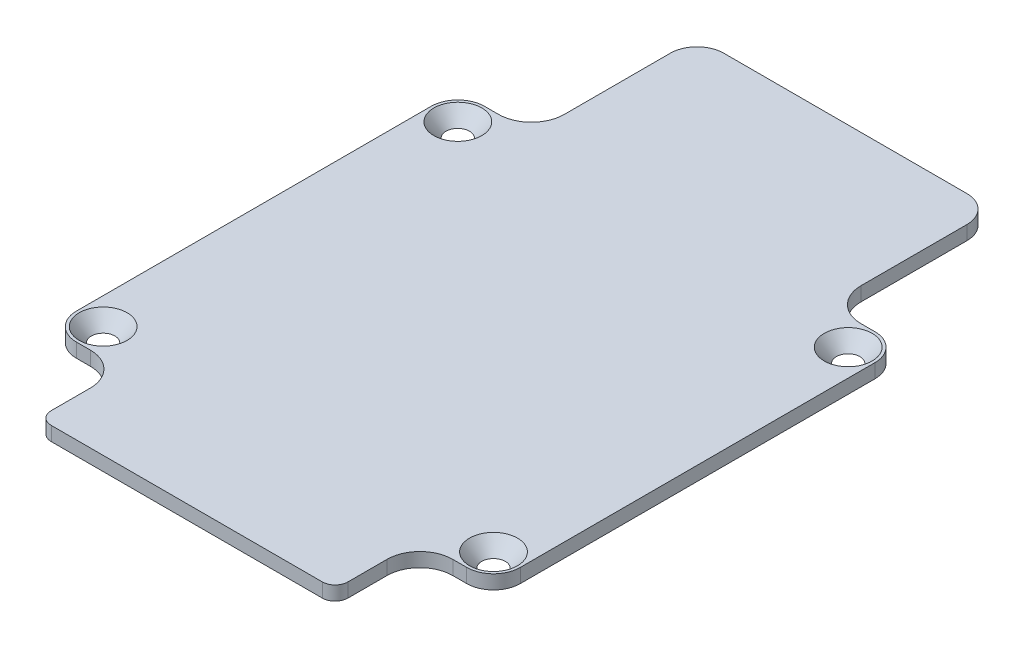
ISO-10303-21;
HEADER;
FILE_DESCRIPTION(('STEP AP214'),'2;1');
FILE_NAME('part.step','',(''),(''),'','','');
FILE_SCHEMA(('AUTOMOTIVE_DESIGN { 1 0 10303 214 1 1 1 1 }'));
ENDSEC;
DATA;
#1=APPLICATION_CONTEXT('core data for automotive mechanical design processes');
#2=APPLICATION_PROTOCOL_DEFINITION('international standard','automotive_design',2000,#1);
#3=PRODUCT_CONTEXT('',#1,'mechanical');
#4=PRODUCT('Part','Part','',(#3));
#5=PRODUCT_RELATED_PRODUCT_CATEGORY('part','',(#4));
#6=PRODUCT_DEFINITION_FORMATION('','',#4);
#7=PRODUCT_DEFINITION_CONTEXT('part definition',#1,'design');
#8=PRODUCT_DEFINITION('design','',#6,#7);
#9=PRODUCT_DEFINITION_SHAPE('','',#8);
#10=(LENGTH_UNIT() NAMED_UNIT(*) SI_UNIT(.MILLI.,.METRE.));
#11=(NAMED_UNIT(*) PLANE_ANGLE_UNIT() SI_UNIT($,.RADIAN.));
#12=(NAMED_UNIT(*) SI_UNIT($,.STERADIAN.) SOLID_ANGLE_UNIT());
#13=UNCERTAINTY_MEASURE_WITH_UNIT(LENGTH_MEASURE(1.E-05),#10,'distance_accuracy_value','');
#14=(GEOMETRIC_REPRESENTATION_CONTEXT(3) GLOBAL_UNCERTAINTY_ASSIGNED_CONTEXT((#13)) GLOBAL_UNIT_ASSIGNED_CONTEXT((#10,
#11,#12)) REPRESENTATION_CONTEXT('',''));
#15=CARTESIAN_POINT('',(0.,0.,0.));
#16=DIRECTION('',(0.,0.,1.));
#17=DIRECTION('',(1.,0.,0.));
#18=AXIS2_PLACEMENT_3D('',#15,#16,#17);
#19=CARTESIAN_POINT('',(22.225,7.925,20.193));
#20=DIRECTION('',(0.,1.,0.));
#21=DIRECTION('',(0.,0.,1.));
#22=AXIS2_PLACEMENT_3D('',#19,#20,#21);
#23=CYLINDRICAL_SURFACE('',#22,3.048);
#24=CARTESIAN_POINT('',(22.225,9.525,20.193));
#25=DIRECTION('',(0.,1.,0.));
#26=DIRECTION('',(0.,0.,1.));
#27=AXIS2_PLACEMENT_3D('',#24,#25,#26);
#28=CIRCLE('',#27,3.048);
#29=CARTESIAN_POINT('',(22.225,9.525,23.241));
#30=VERTEX_POINT('',#29);
#31=CARTESIAN_POINT('',(25.273,9.525,20.193));
#32=VERTEX_POINT('',#31);
#33=EDGE_CURVE('E228',#30,#32,#28,.T.);
#34=ORIENTED_EDGE('',*,*,#33,.F.);
#35=DIRECTION('',(0.,1.,0.));
#36=VECTOR('',#35,1.);
#37=CARTESIAN_POINT('',(22.225,7.925,23.241));
#38=LINE('',#37,#36);
#39=CARTESIAN_POINT('',(22.225,7.925,23.241));
#40=VERTEX_POINT('',#39);
#41=EDGE_CURVE('E11',#40,#30,#38,.T.);
#42=ORIENTED_EDGE('',*,*,#41,.F.);
#43=CARTESIAN_POINT('',(22.225,7.925,20.193));
#44=DIRECTION('',(0.,1.,0.));
#45=DIRECTION('',(0.,0.,1.));
#46=AXIS2_PLACEMENT_3D('',#43,#44,#45);
#47=CIRCLE('',#46,3.048);
#48=CARTESIAN_POINT('',(25.273,7.925,20.193));
#49=VERTEX_POINT('',#48);
#50=EDGE_CURVE('E297',#40,#49,#47,.T.);
#51=ORIENTED_EDGE('',*,*,#50,.T.);
#52=DIRECTION('',(0.,1.,0.));
#53=VECTOR('',#52,1.);
#54=CARTESIAN_POINT('',(25.273,7.925,20.193));
#55=LINE('',#54,#53);
#56=EDGE_CURVE('E138',#49,#32,#55,.T.);
#57=ORIENTED_EDGE('',*,*,#56,.T.);
#58=EDGE_LOOP('',(#34,#42,#51,#57));
#59=FACE_BOUND('',#58,.T.);
#60=ADVANCED_FACE('F34',(#59),#23,.T.);
#61=CARTESIAN_POINT('',(20.6375,7.925,23.241));
#62=DIRECTION('',(0.,0.,1.));
#63=DIRECTION('',(1.,0.,0.));
#64=AXIS2_PLACEMENT_3D('',#61,#62,#63);
#65=PLANE('',#64);
#66=DIRECTION('',(1.,0.,0.));
#67=VECTOR('',#66,1.);
#68=CARTESIAN_POINT('',(20.6375,9.525,23.241));
#69=LINE('',#68,#67);
#70=CARTESIAN_POINT('',(20.6375,9.525,23.241));
#71=VERTEX_POINT('',#70);
#72=EDGE_CURVE('E295',#71,#30,#69,.T.);
#73=ORIENTED_EDGE('',*,*,#72,.F.);
#74=DIRECTION('',(0.,1.,0.));
#75=VECTOR('',#74,1.);
#76=CARTESIAN_POINT('',(20.6375,7.925,23.241));
#77=LINE('',#76,#75);
#78=CARTESIAN_POINT('',(20.6375,7.925,23.241));
#79=VERTEX_POINT('',#78);
#80=EDGE_CURVE('E43',#79,#71,#77,.T.);
#81=ORIENTED_EDGE('',*,*,#80,.F.);
#82=DIRECTION('',(1.,0.,0.));
#83=VECTOR('',#82,1.);
#84=CARTESIAN_POINT('',(20.6375,7.925,23.241));
#85=LINE('',#84,#83);
#86=EDGE_CURVE('E210',#79,#40,#85,.T.);
#87=ORIENTED_EDGE('',*,*,#86,.T.);
#88=ORIENTED_EDGE('',*,*,#41,.T.);
#89=EDGE_LOOP('',(#73,#81,#87,#88));
#90=FACE_BOUND('',#89,.T.);
#91=ADVANCED_FACE('F342',(#90),#65,.T.);
#92=CARTESIAN_POINT('',(20.6375,7.925,26.9875));
#93=DIRECTION('',(0.,1.,0.));
#94=DIRECTION('',(0.,0.,1.));
#95=AXIS2_PLACEMENT_3D('',#92,#93,#94);
#96=CYLINDRICAL_SURFACE('',#95,3.74649999999999);
#97=CARTESIAN_POINT('',(20.6375,9.525,26.9875));
#98=DIRECTION('',(0.,1.,0.));
#99=DIRECTION('',(0.,0.,1.));
#100=AXIS2_PLACEMENT_3D('',#97,#98,#99);
#101=CIRCLE('',#100,3.74649999999999);
#102=CARTESIAN_POINT('',(16.891,9.525,26.9875));
#103=VERTEX_POINT('',#102);
#104=EDGE_CURVE('E214',#71,#103,#101,.T.);
#105=ORIENTED_EDGE('',*,*,#104,.T.);
#106=DIRECTION('',(0.,1.,0.));
#107=VECTOR('',#106,1.);
#108=CARTESIAN_POINT('',(16.891,7.925,26.9875));
#109=LINE('',#108,#107);
#110=CARTESIAN_POINT('',(16.891,7.925,26.9875));
#111=VERTEX_POINT('',#110);
#112=EDGE_CURVE('E212',#111,#103,#109,.T.);
#113=ORIENTED_EDGE('',*,*,#112,.F.);
#114=CARTESIAN_POINT('',(20.6375,7.925,26.9875));
#115=DIRECTION('',(0.,1.,0.));
#116=DIRECTION('',(0.,0.,1.));
#117=AXIS2_PLACEMENT_3D('',#114,#115,#116);
#118=CIRCLE('',#117,3.74649999999999);
#119=EDGE_CURVE('E203',#79,#111,#118,.T.);
#120=ORIENTED_EDGE('',*,*,#119,.F.);
#121=ORIENTED_EDGE('',*,*,#80,.T.);
#122=EDGE_LOOP('',(#105,#113,#120,#121));
#123=FACE_BOUND('',#122,.T.);
#124=ADVANCED_FACE('F213',(#123),#96,.F.);
#125=CARTESIAN_POINT('',(16.891,7.925,31.4325));
#126=DIRECTION('',(1.,0.,0.));
#127=DIRECTION('',(0.,0.,-1.));
#128=AXIS2_PLACEMENT_3D('',#125,#126,#127);
#129=PLANE('',#128);
#130=DIRECTION('',(0.,0.,-1.));
#131=VECTOR('',#130,1.);
#132=CARTESIAN_POINT('',(16.891,9.525,31.4325));
#133=LINE('',#132,#131);
#134=CARTESIAN_POINT('',(16.891,9.525,31.4325));
#135=VERTEX_POINT('',#134);
#136=EDGE_CURVE('E292',#135,#103,#133,.T.);
#137=ORIENTED_EDGE('',*,*,#136,.F.);
#138=DIRECTION('',(0.,1.,0.));
#139=VECTOR('',#138,1.);
#140=CARTESIAN_POINT('',(16.891,7.925,31.4325));
#141=LINE('',#140,#139);
#142=CARTESIAN_POINT('',(16.891,7.925,31.4325));
#143=VERTEX_POINT('',#142);
#144=EDGE_CURVE('E218',#143,#135,#141,.T.);
#145=ORIENTED_EDGE('',*,*,#144,.F.);
#146=DIRECTION('',(0.,0.,-1.));
#147=VECTOR('',#146,1.);
#148=CARTESIAN_POINT('',(16.891,7.925,31.4325));
#149=LINE('',#148,#147);
#150=EDGE_CURVE('E208',#143,#111,#149,.T.);
#151=ORIENTED_EDGE('',*,*,#150,.T.);
#152=ORIENTED_EDGE('',*,*,#112,.T.);
#153=EDGE_LOOP('',(#137,#145,#151,#152));
#154=FACE_BOUND('',#153,.T.);
#155=ADVANCED_FACE('F220',(#154),#129,.T.);
#156=CARTESIAN_POINT('',(15.4305,7.925,31.4325));
#157=DIRECTION('',(0.,1.,0.));
#158=DIRECTION('',(0.,0.,1.));
#159=AXIS2_PLACEMENT_3D('',#156,#157,#158);
#160=CYLINDRICAL_SURFACE('',#159,1.4605);
#161=CARTESIAN_POINT('',(15.4305,9.525,31.4325));
#162=DIRECTION('',(0.,1.,0.));
#163=DIRECTION('',(0.,0.,1.));
#164=AXIS2_PLACEMENT_3D('',#161,#162,#163);
#165=CIRCLE('',#164,1.4605);
#166=CARTESIAN_POINT('',(15.4305,9.525,32.893));
#167=VERTEX_POINT('',#166);
#168=EDGE_CURVE('E289',#167,#135,#165,.T.);
#169=ORIENTED_EDGE('',*,*,#168,.F.);
#170=DIRECTION('',(0.,1.,0.));
#171=VECTOR('',#170,1.);
#172=CARTESIAN_POINT('',(15.4305,7.925,32.893));
#173=LINE('',#172,#171);
#174=CARTESIAN_POINT('',(15.4305,7.925,32.893));
#175=VERTEX_POINT('',#174);
#176=EDGE_CURVE('E301',#175,#167,#173,.T.);
#177=ORIENTED_EDGE('',*,*,#176,.F.);
#178=CARTESIAN_POINT('',(15.4305,7.925,31.4325));
#179=DIRECTION('',(0.,1.,0.));
#180=DIRECTION('',(0.,0.,1.));
#181=AXIS2_PLACEMENT_3D('',#178,#179,#180);
#182=CIRCLE('',#181,1.4605);
#183=EDGE_CURVE('E221',#175,#143,#182,.T.);
#184=ORIENTED_EDGE('',*,*,#183,.T.);
#185=ORIENTED_EDGE('',*,*,#144,.T.);
#186=EDGE_LOOP('',(#169,#177,#184,#185));
#187=FACE_BOUND('',#186,.T.);
#188=ADVANCED_FACE('F355',(#187),#160,.T.);
#189=CARTESIAN_POINT('',(-15.4305,7.925,32.893));
#190=DIRECTION('',(0.,0.,1.));
#191=DIRECTION('',(1.,0.,0.));
#192=AXIS2_PLACEMENT_3D('',#189,#190,#191);
#193=PLANE('',#192);
#194=DIRECTION('',(1.,0.,0.));
#195=VECTOR('',#194,1.);
#196=CARTESIAN_POINT('',(-15.4305,9.525,32.893));
#197=LINE('',#196,#195);
#198=CARTESIAN_POINT('',(-15.4305,9.525,32.893));
#199=VERTEX_POINT('',#198);
#200=EDGE_CURVE('E286',#199,#167,#197,.T.);
#201=ORIENTED_EDGE('',*,*,#200,.F.);
#202=DIRECTION('',(0.,1.,0.));
#203=VECTOR('',#202,1.);
#204=CARTESIAN_POINT('',(-15.4305,7.925,32.893));
#205=LINE('',#204,#203);
#206=CARTESIAN_POINT('',(-15.4305,7.925,32.893));
#207=VERTEX_POINT('',#206);
#208=EDGE_CURVE('E303',#207,#199,#205,.T.);
#209=ORIENTED_EDGE('',*,*,#208,.F.);
#210=DIRECTION('',(1.,0.,0.));
#211=VECTOR('',#210,1.);
#212=CARTESIAN_POINT('',(-15.4305,7.925,32.893));
#213=LINE('',#212,#211);
#214=EDGE_CURVE('E223',#207,#175,#213,.T.);
#215=ORIENTED_EDGE('',*,*,#214,.T.);
#216=ORIENTED_EDGE('',*,*,#176,.T.);
#217=EDGE_LOOP('',(#201,#209,#215,#216));
#218=FACE_BOUND('',#217,.T.);
#219=ADVANCED_FACE('F358',(#218),#193,.T.);
#220=CARTESIAN_POINT('',(-15.4305,7.925,31.4325));
#221=DIRECTION('',(0.,1.,0.));
#222=DIRECTION('',(0.,0.,1.));
#223=AXIS2_PLACEMENT_3D('',#220,#221,#222);
#224=CYLINDRICAL_SURFACE('',#223,1.4605);
#225=CARTESIAN_POINT('',(-15.4305,9.525,31.4325));
#226=DIRECTION('',(0.,1.,0.));
#227=DIRECTION('',(0.,0.,1.));
#228=AXIS2_PLACEMENT_3D('',#225,#226,#227);
#229=CIRCLE('',#228,1.4605);
#230=CARTESIAN_POINT('',(-16.891,9.525,31.4325));
#231=VERTEX_POINT('',#230);
#232=EDGE_CURVE('E283',#231,#199,#229,.T.);
#233=ORIENTED_EDGE('',*,*,#232,.F.);
#234=DIRECTION('',(0.,1.,0.));
#235=VECTOR('',#234,1.);
#236=CARTESIAN_POINT('',(-16.891,7.925,31.4325));
#237=LINE('',#236,#235);
#238=CARTESIAN_POINT('',(-16.891,7.925,31.4325));
#239=VERTEX_POINT('',#238);
#240=EDGE_CURVE('E305',#239,#231,#237,.T.);
#241=ORIENTED_EDGE('',*,*,#240,.F.);
#242=CARTESIAN_POINT('',(-15.4305,7.925,31.4325));
#243=DIRECTION('',(0.,1.,0.));
#244=DIRECTION('',(0.,0.,1.));
#245=AXIS2_PLACEMENT_3D('',#242,#243,#244);
#246=CIRCLE('',#245,1.4605);
#247=EDGE_CURVE('E531',#239,#207,#246,.T.);
#248=ORIENTED_EDGE('',*,*,#247,.T.);
#249=ORIENTED_EDGE('',*,*,#208,.T.);
#250=EDGE_LOOP('',(#233,#241,#248,#249));
#251=FACE_BOUND('',#250,.T.);
#252=ADVANCED_FACE('F362',(#251),#224,.T.);
#253=CARTESIAN_POINT('',(-16.891,7.925,26.9875));
#254=DIRECTION('',(-1.,0.,0.));
#255=DIRECTION('',(0.,0.,1.));
#256=AXIS2_PLACEMENT_3D('',#253,#254,#255);
#257=PLANE('',#256);
#258=DIRECTION('',(0.,0.,1.));
#259=VECTOR('',#258,1.);
#260=CARTESIAN_POINT('',(-16.891,9.525,26.9875));
#261=LINE('',#260,#259);
#262=CARTESIAN_POINT('',(-16.891,9.525,26.9875));
#263=VERTEX_POINT('',#262);
#264=EDGE_CURVE('E280',#263,#231,#261,.T.);
#265=ORIENTED_EDGE('',*,*,#264,.F.);
#266=DIRECTION('',(0.,1.,0.));
#267=VECTOR('',#266,1.);
#268=CARTESIAN_POINT('',(-16.891,7.925,26.9875));
#269=LINE('',#268,#267);
#270=CARTESIAN_POINT('',(-16.891,7.925,26.9875));
#271=VERTEX_POINT('',#270);
#272=EDGE_CURVE('E307',#271,#263,#269,.T.);
#273=ORIENTED_EDGE('',*,*,#272,.F.);
#274=DIRECTION('',(0.,0.,1.));
#275=VECTOR('',#274,1.);
#276=CARTESIAN_POINT('',(-16.891,7.925,26.9875));
#277=LINE('',#276,#275);
#278=EDGE_CURVE('E528',#271,#239,#277,.T.);
#279=ORIENTED_EDGE('',*,*,#278,.T.);
#280=ORIENTED_EDGE('',*,*,#240,.T.);
#281=EDGE_LOOP('',(#265,#273,#279,#280));
#282=FACE_BOUND('',#281,.T.);
#283=ADVANCED_FACE('F366',(#282),#257,.T.);
#284=CARTESIAN_POINT('',(-20.6375,7.925,26.9875));
#285=DIRECTION('',(0.,1.,0.));
#286=DIRECTION('',(0.,0.,1.));
#287=AXIS2_PLACEMENT_3D('',#284,#285,#286);
#288=CYLINDRICAL_SURFACE('',#287,3.7465);
#289=CARTESIAN_POINT('',(-20.6375,9.525,26.9875));
#290=DIRECTION('',(0.,1.,0.));
#291=DIRECTION('',(0.,0.,1.));
#292=AXIS2_PLACEMENT_3D('',#289,#290,#291);
#293=CIRCLE('',#292,3.7465);
#294=CARTESIAN_POINT('',(-20.6375,9.525,23.241));
#295=VERTEX_POINT('',#294);
#296=EDGE_CURVE('E277',#263,#295,#293,.T.);
#297=ORIENTED_EDGE('',*,*,#296,.T.);
#298=DIRECTION('',(0.,1.,0.));
#299=VECTOR('',#298,1.);
#300=CARTESIAN_POINT('',(-20.6375,7.925,23.241));
#301=LINE('',#300,#299);
#302=CARTESIAN_POINT('',(-20.6375,7.925,23.241));
#303=VERTEX_POINT('',#302);
#304=EDGE_CURVE('E309',#303,#295,#301,.T.);
#305=ORIENTED_EDGE('',*,*,#304,.F.);
#306=CARTESIAN_POINT('',(-20.6375,7.925,26.9875));
#307=DIRECTION('',(0.,1.,0.));
#308=DIRECTION('',(0.,0.,1.));
#309=AXIS2_PLACEMENT_3D('',#306,#307,#308);
#310=CIRCLE('',#309,3.7465);
#311=EDGE_CURVE('E526',#271,#303,#310,.T.);
#312=ORIENTED_EDGE('',*,*,#311,.F.);
#313=ORIENTED_EDGE('',*,*,#272,.T.);
#314=EDGE_LOOP('',(#297,#305,#312,#313));
#315=FACE_BOUND('',#314,.T.);
#316=ADVANCED_FACE('F370',(#315),#288,.F.);
#317=CARTESIAN_POINT('',(-22.225,7.925,23.241));
#318=DIRECTION('',(0.,0.,1.));
#319=DIRECTION('',(1.,0.,0.));
#320=AXIS2_PLACEMENT_3D('',#317,#318,#319);
#321=PLANE('',#320);
#322=DIRECTION('',(1.,0.,0.));
#323=VECTOR('',#322,1.);
#324=CARTESIAN_POINT('',(-22.225,9.525,23.241));
#325=LINE('',#324,#323);
#326=CARTESIAN_POINT('',(-22.225,9.525,23.241));
#327=VERTEX_POINT('',#326);
#328=EDGE_CURVE('E274',#327,#295,#325,.T.);
#329=ORIENTED_EDGE('',*,*,#328,.F.);
#330=DIRECTION('',(0.,1.,0.));
#331=VECTOR('',#330,1.);
#332=CARTESIAN_POINT('',(-22.225,7.925,23.241));
#333=LINE('',#332,#331);
#334=CARTESIAN_POINT('',(-22.225,7.925,23.241));
#335=VERTEX_POINT('',#334);
#336=EDGE_CURVE('E311',#335,#327,#333,.T.);
#337=ORIENTED_EDGE('',*,*,#336,.F.);
#338=DIRECTION('',(1.,0.,0.));
#339=VECTOR('',#338,1.);
#340=CARTESIAN_POINT('',(-22.225,7.925,23.241));
#341=LINE('',#340,#339);
#342=EDGE_CURVE('E523',#335,#303,#341,.T.);
#343=ORIENTED_EDGE('',*,*,#342,.T.);
#344=ORIENTED_EDGE('',*,*,#304,.T.);
#345=EDGE_LOOP('',(#329,#337,#343,#344));
#346=FACE_BOUND('',#345,.T.);
#347=ADVANCED_FACE('F374',(#346),#321,.T.);
#348=CARTESIAN_POINT('',(-22.225,7.925,20.193));
#349=DIRECTION('',(0.,1.,0.));
#350=DIRECTION('',(0.,0.,1.));
#351=AXIS2_PLACEMENT_3D('',#348,#349,#350);
#352=CYLINDRICAL_SURFACE('',#351,3.048);
#353=CARTESIAN_POINT('',(-22.225,9.525,20.193));
#354=DIRECTION('',(0.,1.,0.));
#355=DIRECTION('',(0.,0.,1.));
#356=AXIS2_PLACEMENT_3D('',#353,#354,#355);
#357=CIRCLE('',#356,3.048);
#358=CARTESIAN_POINT('',(-25.273,9.525,20.193));
#359=VERTEX_POINT('',#358);
#360=EDGE_CURVE('E271',#359,#327,#357,.T.);
#361=ORIENTED_EDGE('',*,*,#360,.F.);
#362=DIRECTION('',(0.,1.,0.));
#363=VECTOR('',#362,1.);
#364=CARTESIAN_POINT('',(-25.273,7.925,20.193));
#365=LINE('',#364,#363);
#366=CARTESIAN_POINT('',(-25.273,7.925,20.193));
#367=VERTEX_POINT('',#366);
#368=EDGE_CURVE('E313',#367,#359,#365,.T.);
#369=ORIENTED_EDGE('',*,*,#368,.F.);
#370=CARTESIAN_POINT('',(-22.225,7.925,20.193));
#371=DIRECTION('',(0.,1.,0.));
#372=DIRECTION('',(0.,0.,1.));
#373=AXIS2_PLACEMENT_3D('',#370,#371,#372);
#374=CIRCLE('',#373,3.048);
#375=EDGE_CURVE('E520',#367,#335,#374,.T.);
#376=ORIENTED_EDGE('',*,*,#375,.T.);
#377=ORIENTED_EDGE('',*,*,#336,.T.);
#378=EDGE_LOOP('',(#361,#369,#376,#377));
#379=FACE_BOUND('',#378,.T.);
#380=ADVANCED_FACE('F378',(#379),#352,.T.);
#381=CARTESIAN_POINT('',(-25.273,7.925,-20.193));
#382=DIRECTION('',(-1.,0.,0.));
#383=DIRECTION('',(0.,0.,1.));
#384=AXIS2_PLACEMENT_3D('',#381,#382,#383);
#385=PLANE('',#384);
#386=DIRECTION('',(0.,0.,1.));
#387=VECTOR('',#386,1.);
#388=CARTESIAN_POINT('',(-25.273,9.525,-20.193));
#389=LINE('',#388,#387);
#390=CARTESIAN_POINT('',(-25.273,9.525,-20.193));
#391=VERTEX_POINT('',#390);
#392=EDGE_CURVE('E268',#391,#359,#389,.T.);
#393=ORIENTED_EDGE('',*,*,#392,.F.);
#394=DIRECTION('',(0.,1.,0.));
#395=VECTOR('',#394,1.);
#396=CARTESIAN_POINT('',(-25.273,7.925,-20.193));
#397=LINE('',#396,#395);
#398=CARTESIAN_POINT('',(-25.273,7.925,-20.193));
#399=VERTEX_POINT('',#398);
#400=EDGE_CURVE('E315',#399,#391,#397,.T.);
#401=ORIENTED_EDGE('',*,*,#400,.F.);
#402=DIRECTION('',(0.,0.,1.));
#403=VECTOR('',#402,1.);
#404=CARTESIAN_POINT('',(-25.273,7.925,-20.193));
#405=LINE('',#404,#403);
#406=EDGE_CURVE('E517',#399,#367,#405,.T.);
#407=ORIENTED_EDGE('',*,*,#406,.T.);
#408=ORIENTED_EDGE('',*,*,#368,.T.);
#409=EDGE_LOOP('',(#393,#401,#407,#408));
#410=FACE_BOUND('',#409,.T.);
#411=ADVANCED_FACE('F382',(#410),#385,.T.);
#412=CARTESIAN_POINT('',(-22.225,7.925,-20.193));
#413=DIRECTION('',(0.,1.,0.));
#414=DIRECTION('',(0.,0.,1.));
#415=AXIS2_PLACEMENT_3D('',#412,#413,#414);
#416=CYLINDRICAL_SURFACE('',#415,3.04800000000001);
#417=CARTESIAN_POINT('',(-22.225,9.525,-20.193));
#418=DIRECTION('',(0.,1.,0.));
#419=DIRECTION('',(0.,0.,1.));
#420=AXIS2_PLACEMENT_3D('',#417,#418,#419);
#421=CIRCLE('',#420,3.04800000000001);
#422=CARTESIAN_POINT('',(-22.225,9.525,-23.241));
#423=VERTEX_POINT('',#422);
#424=EDGE_CURVE('E265',#423,#391,#421,.T.);
#425=ORIENTED_EDGE('',*,*,#424,.F.);
#426=DIRECTION('',(0.,1.,0.));
#427=VECTOR('',#426,1.);
#428=CARTESIAN_POINT('',(-22.225,7.925,-23.241));
#429=LINE('',#428,#427);
#430=CARTESIAN_POINT('',(-22.225,7.925,-23.241));
#431=VERTEX_POINT('',#430);
#432=EDGE_CURVE('E317',#431,#423,#429,.T.);
#433=ORIENTED_EDGE('',*,*,#432,.F.);
#434=CARTESIAN_POINT('',(-22.225,7.925,-20.193));
#435=DIRECTION('',(0.,1.,0.));
#436=DIRECTION('',(0.,0.,1.));
#437=AXIS2_PLACEMENT_3D('',#434,#435,#436);
#438=CIRCLE('',#437,3.04800000000001);
#439=EDGE_CURVE('E514',#431,#399,#438,.T.);
#440=ORIENTED_EDGE('',*,*,#439,.T.);
#441=ORIENTED_EDGE('',*,*,#400,.T.);
#442=EDGE_LOOP('',(#425,#433,#440,#441));
#443=FACE_BOUND('',#442,.T.);
#444=ADVANCED_FACE('F386',(#443),#416,.T.);
#445=CARTESIAN_POINT('',(-20.6375,7.925,-23.241));
#446=DIRECTION('',(0.,0.,-1.));
#447=DIRECTION('',(-1.,0.,0.));
#448=AXIS2_PLACEMENT_3D('',#445,#446,#447);
#449=PLANE('',#448);
#450=DIRECTION('',(-1.,0.,0.));
#451=VECTOR('',#450,1.);
#452=CARTESIAN_POINT('',(-20.6375,9.525,-23.241));
#453=LINE('',#452,#451);
#454=CARTESIAN_POINT('',(-20.6375,9.525,-23.241));
#455=VERTEX_POINT('',#454);
#456=EDGE_CURVE('E262',#455,#423,#453,.T.);
#457=ORIENTED_EDGE('',*,*,#456,.F.);
#458=DIRECTION('',(0.,1.,0.));
#459=VECTOR('',#458,1.);
#460=CARTESIAN_POINT('',(-20.6375,7.925,-23.241));
#461=LINE('',#460,#459);
#462=CARTESIAN_POINT('',(-20.6375,7.925,-23.241));
#463=VERTEX_POINT('',#462);
#464=EDGE_CURVE('E319',#463,#455,#461,.T.);
#465=ORIENTED_EDGE('',*,*,#464,.F.);
#466=DIRECTION('',(-1.,0.,0.));
#467=VECTOR('',#466,1.);
#468=CARTESIAN_POINT('',(-20.6375,7.925,-23.241));
#469=LINE('',#468,#467);
#470=EDGE_CURVE('E511',#463,#431,#469,.T.);
#471=ORIENTED_EDGE('',*,*,#470,.T.);
#472=ORIENTED_EDGE('',*,*,#432,.T.);
#473=EDGE_LOOP('',(#457,#465,#471,#472));
#474=FACE_BOUND('',#473,.T.);
#475=ADVANCED_FACE('F390',(#474),#449,.T.);
#476=CARTESIAN_POINT('',(-20.6375,7.925,-26.9875));
#477=DIRECTION('',(0.,1.,0.));
#478=DIRECTION('',(0.,0.,1.));
#479=AXIS2_PLACEMENT_3D('',#476,#477,#478);
#480=CYLINDRICAL_SURFACE('',#479,3.74649999999998);
#481=CARTESIAN_POINT('',(-20.6375,9.525,-26.9875));
#482=DIRECTION('',(0.,1.,0.));
#483=DIRECTION('',(0.,0.,1.));
#484=AXIS2_PLACEMENT_3D('',#481,#482,#483);
#485=CIRCLE('',#484,3.74649999999998);
#486=CARTESIAN_POINT('',(-16.891,9.525,-26.9875));
#487=VERTEX_POINT('',#486);
#488=EDGE_CURVE('E259',#455,#487,#485,.T.);
#489=ORIENTED_EDGE('',*,*,#488,.T.);
#490=DIRECTION('',(0.,1.,0.));
#491=VECTOR('',#490,1.);
#492=CARTESIAN_POINT('',(-16.891,7.925,-26.9875));
#493=LINE('',#492,#491);
#494=CARTESIAN_POINT('',(-16.891,7.925,-26.9875));
#495=VERTEX_POINT('',#494);
#496=EDGE_CURVE('E321',#495,#487,#493,.T.);
#497=ORIENTED_EDGE('',*,*,#496,.F.);
#498=CARTESIAN_POINT('',(-20.6375,7.925,-26.9875));
#499=DIRECTION('',(0.,1.,0.));
#500=DIRECTION('',(0.,0.,1.));
#501=AXIS2_PLACEMENT_3D('',#498,#499,#500);
#502=CIRCLE('',#501,3.74649999999998);
#503=EDGE_CURVE('E509',#463,#495,#502,.T.);
#504=ORIENTED_EDGE('',*,*,#503,.F.);
#505=ORIENTED_EDGE('',*,*,#464,.T.);
#506=EDGE_LOOP('',(#489,#497,#504,#505));
#507=FACE_BOUND('',#506,.T.);
#508=ADVANCED_FACE('F394',(#507),#480,.F.);
#509=CARTESIAN_POINT('',(-16.891,7.925,-39.0525));
#510=DIRECTION('',(-1.,0.,0.));
#511=DIRECTION('',(0.,0.,1.));
#512=AXIS2_PLACEMENT_3D('',#509,#510,#511);
#513=PLANE('',#512);
#514=DIRECTION('',(0.,0.,1.));
#515=VECTOR('',#514,1.);
#516=CARTESIAN_POINT('',(-16.891,9.525,-39.0525));
#517=LINE('',#516,#515);
#518=CARTESIAN_POINT('',(-16.891,9.525,-39.0525));
#519=VERTEX_POINT('',#518);
#520=EDGE_CURVE('E256',#519,#487,#517,.T.);
#521=ORIENTED_EDGE('',*,*,#520,.F.);
#522=DIRECTION('',(0.,1.,0.));
#523=VECTOR('',#522,1.);
#524=CARTESIAN_POINT('',(-16.891,7.925,-39.0525));
#525=LINE('',#524,#523);
#526=CARTESIAN_POINT('',(-16.891,7.925,-39.0525));
#527=VERTEX_POINT('',#526);
#528=EDGE_CURVE('E323',#527,#519,#525,.T.);
#529=ORIENTED_EDGE('',*,*,#528,.F.);
#530=DIRECTION('',(0.,0.,1.));
#531=VECTOR('',#530,1.);
#532=CARTESIAN_POINT('',(-16.891,7.925,-39.0525));
#533=LINE('',#532,#531);
#534=EDGE_CURVE('E506',#527,#495,#533,.T.);
#535=ORIENTED_EDGE('',*,*,#534,.T.);
#536=ORIENTED_EDGE('',*,*,#496,.T.);
#537=EDGE_LOOP('',(#521,#529,#535,#536));
#538=FACE_BOUND('',#537,.T.);
#539=ADVANCED_FACE('F398',(#538),#513,.T.);
#540=CARTESIAN_POINT('',(-13.843,7.925,-39.0525));
#541=DIRECTION('',(0.,1.,0.));
#542=DIRECTION('',(0.,0.,1.));
#543=AXIS2_PLACEMENT_3D('',#540,#541,#542);
#544=CYLINDRICAL_SURFACE('',#543,3.048);
#545=CARTESIAN_POINT('',(-13.843,9.525,-39.0525));
#546=DIRECTION('',(0.,1.,0.));
#547=DIRECTION('',(0.,0.,1.));
#548=AXIS2_PLACEMENT_3D('',#545,#546,#547);
#549=CIRCLE('',#548,3.048);
#550=CARTESIAN_POINT('',(-13.843,9.525,-42.1005));
#551=VERTEX_POINT('',#550);
#552=EDGE_CURVE('E253',#551,#519,#549,.T.);
#553=ORIENTED_EDGE('',*,*,#552,.F.);
#554=DIRECTION('',(0.,1.,0.));
#555=VECTOR('',#554,1.);
#556=CARTESIAN_POINT('',(-13.843,7.925,-42.1005));
#557=LINE('',#556,#555);
#558=CARTESIAN_POINT('',(-13.843,7.925,-42.1005));
#559=VERTEX_POINT('',#558);
#560=EDGE_CURVE('E325',#559,#551,#557,.T.);
#561=ORIENTED_EDGE('',*,*,#560,.F.);
#562=CARTESIAN_POINT('',(-13.843,7.925,-39.0525));
#563=DIRECTION('',(0.,1.,0.));
#564=DIRECTION('',(0.,0.,1.));
#565=AXIS2_PLACEMENT_3D('',#562,#563,#564);
#566=CIRCLE('',#565,3.048);
#567=EDGE_CURVE('E503',#559,#527,#566,.T.);
#568=ORIENTED_EDGE('',*,*,#567,.T.);
#569=ORIENTED_EDGE('',*,*,#528,.T.);
#570=EDGE_LOOP('',(#553,#561,#568,#569));
#571=FACE_BOUND('',#570,.T.);
#572=ADVANCED_FACE('F402',(#571),#544,.T.);
#573=CARTESIAN_POINT('',(13.843,7.925,-42.1005));
#574=DIRECTION('',(0.,0.,-1.));
#575=DIRECTION('',(-1.,0.,0.));
#576=AXIS2_PLACEMENT_3D('',#573,#574,#575);
#577=PLANE('',#576);
#578=DIRECTION('',(-1.,0.,0.));
#579=VECTOR('',#578,1.);
#580=CARTESIAN_POINT('',(13.843,9.525,-42.1005));
#581=LINE('',#580,#579);
#582=CARTESIAN_POINT('',(13.843,9.525,-42.1005));
#583=VERTEX_POINT('',#582);
#584=EDGE_CURVE('E250',#583,#551,#581,.T.);
#585=ORIENTED_EDGE('',*,*,#584,.F.);
#586=DIRECTION('',(0.,1.,0.));
#587=VECTOR('',#586,1.);
#588=CARTESIAN_POINT('',(13.843,7.925,-42.1005));
#589=LINE('',#588,#587);
#590=CARTESIAN_POINT('',(13.843,7.925,-42.1005));
#591=VERTEX_POINT('',#590);
#592=EDGE_CURVE('E327',#591,#583,#589,.T.);
#593=ORIENTED_EDGE('',*,*,#592,.F.);
#594=DIRECTION('',(-1.,0.,0.));
#595=VECTOR('',#594,1.);
#596=CARTESIAN_POINT('',(13.843,7.925,-42.1005));
#597=LINE('',#596,#595);
#598=EDGE_CURVE('E500',#591,#559,#597,.T.);
#599=ORIENTED_EDGE('',*,*,#598,.T.);
#600=ORIENTED_EDGE('',*,*,#560,.T.);
#601=EDGE_LOOP('',(#585,#593,#599,#600));
#602=FACE_BOUND('',#601,.T.);
#603=ADVANCED_FACE('F406',(#602),#577,.T.);
#604=CARTESIAN_POINT('',(13.843,7.925,-39.0525));
#605=DIRECTION('',(0.,1.,0.));
#606=DIRECTION('',(0.,0.,1.));
#607=AXIS2_PLACEMENT_3D('',#604,#605,#606);
#608=CYLINDRICAL_SURFACE('',#607,3.048);
#609=CARTESIAN_POINT('',(13.843,9.525,-39.0525));
#610=DIRECTION('',(0.,1.,0.));
#611=DIRECTION('',(0.,0.,1.));
#612=AXIS2_PLACEMENT_3D('',#609,#610,#611);
#613=CIRCLE('',#612,3.048);
#614=CARTESIAN_POINT('',(16.891,9.525,-39.0525));
#615=VERTEX_POINT('',#614);
#616=EDGE_CURVE('E247',#615,#583,#613,.T.);
#617=ORIENTED_EDGE('',*,*,#616,.F.);
#618=DIRECTION('',(0.,1.,0.));
#619=VECTOR('',#618,1.);
#620=CARTESIAN_POINT('',(16.891,7.925,-39.0525));
#621=LINE('',#620,#619);
#622=CARTESIAN_POINT('',(16.891,7.925,-39.0525));
#623=VERTEX_POINT('',#622);
#624=EDGE_CURVE('E329',#623,#615,#621,.T.);
#625=ORIENTED_EDGE('',*,*,#624,.F.);
#626=CARTESIAN_POINT('',(13.843,7.925,-39.0525));
#627=DIRECTION('',(0.,1.,0.));
#628=DIRECTION('',(0.,0.,1.));
#629=AXIS2_PLACEMENT_3D('',#626,#627,#628);
#630=CIRCLE('',#629,3.048);
#631=EDGE_CURVE('E497',#623,#591,#630,.T.);
#632=ORIENTED_EDGE('',*,*,#631,.T.);
#633=ORIENTED_EDGE('',*,*,#592,.T.);
#634=EDGE_LOOP('',(#617,#625,#632,#633));
#635=FACE_BOUND('',#634,.T.);
#636=ADVANCED_FACE('F410',(#635),#608,.T.);
#637=CARTESIAN_POINT('',(16.891,7.925,-26.9875));
#638=DIRECTION('',(1.,0.,0.));
#639=DIRECTION('',(0.,0.,-1.));
#640=AXIS2_PLACEMENT_3D('',#637,#638,#639);
#641=PLANE('',#640);
#642=DIRECTION('',(0.,0.,-1.));
#643=VECTOR('',#642,1.);
#644=CARTESIAN_POINT('',(16.891,9.525,-26.9875));
#645=LINE('',#644,#643);
#646=CARTESIAN_POINT('',(16.891,9.525,-26.9875));
#647=VERTEX_POINT('',#646);
#648=EDGE_CURVE('E244',#647,#615,#645,.T.);
#649=ORIENTED_EDGE('',*,*,#648,.F.);
#650=DIRECTION('',(0.,1.,0.));
#651=VECTOR('',#650,1.);
#652=CARTESIAN_POINT('',(16.891,7.925,-26.9875));
#653=LINE('',#652,#651);
#654=CARTESIAN_POINT('',(16.891,7.925,-26.9875));
#655=VERTEX_POINT('',#654);
#656=EDGE_CURVE('E331',#655,#647,#653,.T.);
#657=ORIENTED_EDGE('',*,*,#656,.F.);
#658=DIRECTION('',(0.,0.,-1.));
#659=VECTOR('',#658,1.);
#660=CARTESIAN_POINT('',(16.891,7.925,-26.9875));
#661=LINE('',#660,#659);
#662=EDGE_CURVE('E494',#655,#623,#661,.T.);
#663=ORIENTED_EDGE('',*,*,#662,.T.);
#664=ORIENTED_EDGE('',*,*,#624,.T.);
#665=EDGE_LOOP('',(#649,#657,#663,#664));
#666=FACE_BOUND('',#665,.T.);
#667=ADVANCED_FACE('F414',(#666),#641,.T.);
#668=CARTESIAN_POINT('',(20.6375,7.925,-26.9875));
#669=DIRECTION('',(0.,1.,0.));
#670=DIRECTION('',(0.,0.,1.));
#671=AXIS2_PLACEMENT_3D('',#668,#669,#670);
#672=CYLINDRICAL_SURFACE('',#671,3.74649999999998);
#673=CARTESIAN_POINT('',(20.6375,9.525,-26.9875));
#674=DIRECTION('',(0.,1.,0.));
#675=DIRECTION('',(0.,0.,1.));
#676=AXIS2_PLACEMENT_3D('',#673,#674,#675);
#677=CIRCLE('',#676,3.74649999999998);
#678=CARTESIAN_POINT('',(20.6375,9.525,-23.241));
#679=VERTEX_POINT('',#678);
#680=EDGE_CURVE('E241',#647,#679,#677,.T.);
#681=ORIENTED_EDGE('',*,*,#680,.T.);
#682=DIRECTION('',(0.,1.,0.));
#683=VECTOR('',#682,1.);
#684=CARTESIAN_POINT('',(20.6375,7.925,-23.241));
#685=LINE('',#684,#683);
#686=CARTESIAN_POINT('',(20.6375,7.925,-23.241));
#687=VERTEX_POINT('',#686);
#688=EDGE_CURVE('E333',#687,#679,#685,.T.);
#689=ORIENTED_EDGE('',*,*,#688,.F.);
#690=CARTESIAN_POINT('',(20.6375,7.925,-26.9875));
#691=DIRECTION('',(0.,1.,0.));
#692=DIRECTION('',(0.,0.,1.));
#693=AXIS2_PLACEMENT_3D('',#690,#691,#692);
#694=CIRCLE('',#693,3.74649999999998);
#695=EDGE_CURVE('E492',#655,#687,#694,.T.);
#696=ORIENTED_EDGE('',*,*,#695,.F.);
#697=ORIENTED_EDGE('',*,*,#656,.T.);
#698=EDGE_LOOP('',(#681,#689,#696,#697));
#699=FACE_BOUND('',#698,.T.);
#700=ADVANCED_FACE('F418',(#699),#672,.F.);
#701=CARTESIAN_POINT('',(22.225,7.925,-23.241));
#702=DIRECTION('',(0.,0.,-1.));
#703=DIRECTION('',(-1.,0.,0.));
#704=AXIS2_PLACEMENT_3D('',#701,#702,#703);
#705=PLANE('',#704);
#706=DIRECTION('',(-1.,0.,0.));
#707=VECTOR('',#706,1.);
#708=CARTESIAN_POINT('',(22.225,9.525,-23.241));
#709=LINE('',#708,#707);
#710=CARTESIAN_POINT('',(22.225,9.525,-23.241));
#711=VERTEX_POINT('',#710);
#712=EDGE_CURVE('E238',#711,#679,#709,.T.);
#713=ORIENTED_EDGE('',*,*,#712,.F.);
#714=DIRECTION('',(0.,1.,0.));
#715=VECTOR('',#714,1.);
#716=CARTESIAN_POINT('',(22.225,7.925,-23.241));
#717=LINE('',#716,#715);
#718=CARTESIAN_POINT('',(22.225,7.925,-23.241));
#719=VERTEX_POINT('',#718);
#720=EDGE_CURVE('E335',#719,#711,#717,.T.);
#721=ORIENTED_EDGE('',*,*,#720,.F.);
#722=DIRECTION('',(-1.,0.,0.));
#723=VECTOR('',#722,1.);
#724=CARTESIAN_POINT('',(22.225,7.925,-23.241));
#725=LINE('',#724,#723);
#726=EDGE_CURVE('E489',#719,#687,#725,.T.);
#727=ORIENTED_EDGE('',*,*,#726,.T.);
#728=ORIENTED_EDGE('',*,*,#688,.T.);
#729=EDGE_LOOP('',(#713,#721,#727,#728));
#730=FACE_BOUND('',#729,.T.);
#731=ADVANCED_FACE('F422',(#730),#705,.T.);
#732=CARTESIAN_POINT('',(22.225,7.925,-20.193));
#733=DIRECTION('',(0.,1.,0.));
#734=DIRECTION('',(0.,0.,1.));
#735=AXIS2_PLACEMENT_3D('',#732,#733,#734);
#736=CYLINDRICAL_SURFACE('',#735,3.04800000000001);
#737=CARTESIAN_POINT('',(22.225,9.525,-20.193));
#738=DIRECTION('',(0.,1.,0.));
#739=DIRECTION('',(0.,0.,1.));
#740=AXIS2_PLACEMENT_3D('',#737,#738,#739);
#741=CIRCLE('',#740,3.04800000000001);
#742=CARTESIAN_POINT('',(25.273,9.525,-20.193));
#743=VERTEX_POINT('',#742);
#744=EDGE_CURVE('E235',#743,#711,#741,.T.);
#745=ORIENTED_EDGE('',*,*,#744,.F.);
#746=DIRECTION('',(0.,1.,0.));
#747=VECTOR('',#746,1.);
#748=CARTESIAN_POINT('',(25.273,7.925,-20.193));
#749=LINE('',#748,#747);
#750=CARTESIAN_POINT('',(25.273,7.925,-20.193));
#751=VERTEX_POINT('',#750);
#752=EDGE_CURVE('E337',#751,#743,#749,.T.);
#753=ORIENTED_EDGE('',*,*,#752,.F.);
#754=CARTESIAN_POINT('',(22.225,7.925,-20.193));
#755=DIRECTION('',(0.,1.,0.));
#756=DIRECTION('',(0.,0.,1.));
#757=AXIS2_PLACEMENT_3D('',#754,#755,#756);
#758=CIRCLE('',#757,3.04800000000001);
#759=EDGE_CURVE('E486',#751,#719,#758,.T.);
#760=ORIENTED_EDGE('',*,*,#759,.T.);
#761=ORIENTED_EDGE('',*,*,#720,.T.);
#762=EDGE_LOOP('',(#745,#753,#760,#761));
#763=FACE_BOUND('',#762,.T.);
#764=ADVANCED_FACE('F426',(#763),#736,.T.);
#765=CARTESIAN_POINT('',(25.273,7.925,20.193));
#766=DIRECTION('',(1.,0.,0.));
#767=DIRECTION('',(0.,0.,-1.));
#768=AXIS2_PLACEMENT_3D('',#765,#766,#767);
#769=PLANE('',#768);
#770=DIRECTION('',(0.,0.,-1.));
#771=VECTOR('',#770,1.);
#772=CARTESIAN_POINT('',(25.273,9.525,20.193));
#773=LINE('',#772,#771);
#774=EDGE_CURVE('E231',#32,#743,#773,.T.);
#775=ORIENTED_EDGE('',*,*,#774,.F.);
#776=ORIENTED_EDGE('',*,*,#56,.F.);
#777=DIRECTION('',(0.,0.,-1.));
#778=VECTOR('',#777,1.);
#779=CARTESIAN_POINT('',(25.273,7.925,20.193));
#780=LINE('',#779,#778);
#781=EDGE_CURVE('E484',#49,#751,#780,.T.);
#782=ORIENTED_EDGE('',*,*,#781,.T.);
#783=ORIENTED_EDGE('',*,*,#752,.T.);
#784=EDGE_LOOP('',(#775,#776,#782,#783));
#785=FACE_BOUND('',#784,.T.);
#786=ADVANCED_FACE('F338',(#785),#769,.T.);
#787=CARTESIAN_POINT('',(22.225,7.925,20.193));
#788=DIRECTION('',(0.,1.,0.));
#789=DIRECTION('',(0.,0.,1.));
#790=AXIS2_PLACEMENT_3D('',#787,#788,#789);
#791=PLANE('',#790);
#792=CARTESIAN_POINT('',(22.225,7.925,20.193));
#793=DIRECTION('',(0.,1.,0.));
#794=DIRECTION('',(0.,0.,1.));
#795=AXIS2_PLACEMENT_3D('',#792,#793,#794);
#796=CIRCLE('',#795,1.33964121949404);
#797=CARTESIAN_POINT('',(22.225,7.925,21.532641219494));
#798=VERTEX_POINT('',#797);
#799=EDGE_CURVE('E37',#798,#798,#796,.T.);
#800=ORIENTED_EDGE('',*,*,#799,.T.);
#801=EDGE_LOOP('',(#800));
#802=FACE_BOUND('',#801,.T.);
#803=CARTESIAN_POINT('',(-22.225,7.925,20.193));
#804=DIRECTION('',(0.,1.,0.));
#805=DIRECTION('',(0.,0.,1.));
#806=AXIS2_PLACEMENT_3D('',#803,#804,#805);
#807=CIRCLE('',#806,1.33964121949404);
#808=CARTESIAN_POINT('',(-22.225,7.925,21.532641219494));
#809=VERTEX_POINT('',#808);
#810=EDGE_CURVE('E466',#809,#809,#807,.T.);
#811=ORIENTED_EDGE('',*,*,#810,.T.);
#812=EDGE_LOOP('',(#811));
#813=FACE_BOUND('',#812,.T.);
#814=CARTESIAN_POINT('',(-22.225,7.925,-20.193));
#815=DIRECTION('',(0.,1.,0.));
#816=DIRECTION('',(0.,0.,1.));
#817=AXIS2_PLACEMENT_3D('',#814,#815,#816);
#818=CIRCLE('',#817,1.33964121949404);
#819=CARTESIAN_POINT('',(-22.225,7.925,-18.853358780506));
#820=VERTEX_POINT('',#819);
#821=EDGE_CURVE('E475',#820,#820,#818,.T.);
#822=ORIENTED_EDGE('',*,*,#821,.T.);
#823=EDGE_LOOP('',(#822));
#824=FACE_BOUND('',#823,.T.);
#825=CARTESIAN_POINT('',(22.225,7.925,-20.193));
#826=DIRECTION('',(0.,1.,0.));
#827=DIRECTION('',(0.,0.,1.));
#828=AXIS2_PLACEMENT_3D('',#825,#826,#827);
#829=CIRCLE('',#828,1.33964121949404);
#830=CARTESIAN_POINT('',(22.225,7.925,-18.853358780506));
#831=VERTEX_POINT('',#830);
#832=EDGE_CURVE('E232',#831,#831,#829,.T.);
#833=ORIENTED_EDGE('',*,*,#832,.T.);
#834=EDGE_LOOP('',(#833));
#835=FACE_BOUND('',#834,.T.);
#836=ORIENTED_EDGE('',*,*,#50,.F.);
#837=ORIENTED_EDGE('',*,*,#86,.F.);
#838=ORIENTED_EDGE('',*,*,#119,.T.);
#839=ORIENTED_EDGE('',*,*,#150,.F.);
#840=ORIENTED_EDGE('',*,*,#183,.F.);
#841=ORIENTED_EDGE('',*,*,#214,.F.);
#842=ORIENTED_EDGE('',*,*,#247,.F.);
#843=ORIENTED_EDGE('',*,*,#278,.F.);
#844=ORIENTED_EDGE('',*,*,#311,.T.);
#845=ORIENTED_EDGE('',*,*,#342,.F.);
#846=ORIENTED_EDGE('',*,*,#375,.F.);
#847=ORIENTED_EDGE('',*,*,#406,.F.);
#848=ORIENTED_EDGE('',*,*,#439,.F.);
#849=ORIENTED_EDGE('',*,*,#470,.F.);
#850=ORIENTED_EDGE('',*,*,#503,.T.);
#851=ORIENTED_EDGE('',*,*,#534,.F.);
#852=ORIENTED_EDGE('',*,*,#567,.F.);
#853=ORIENTED_EDGE('',*,*,#598,.F.);
#854=ORIENTED_EDGE('',*,*,#631,.F.);
#855=ORIENTED_EDGE('',*,*,#662,.F.);
#856=ORIENTED_EDGE('',*,*,#695,.T.);
#857=ORIENTED_EDGE('',*,*,#726,.F.);
#858=ORIENTED_EDGE('',*,*,#759,.F.);
#859=ORIENTED_EDGE('',*,*,#781,.F.);
#860=EDGE_LOOP('',(#836,#837,#838,#839,#840,#841,#842,#843,#844,#845,#846,#847,#848,#849,#850,
#851,#852,#853,#854,#855,#856,#857,#858,#859));
#861=FACE_BOUND('',#860,.T.);
#862=ADVANCED_FACE('F205',(#802,#813,#824,#835,#861),#791,.F.);
#863=CARTESIAN_POINT('',(22.225,9.525,20.193));
#864=DIRECTION('',(0.,1.,0.));
#865=DIRECTION('',(0.,0.,1.));
#866=AXIS2_PLACEMENT_3D('',#863,#864,#865);
#867=PLANE('',#866);
#868=CARTESIAN_POINT('',(22.225,9.525,20.193));
#869=DIRECTION('',(0.,1.,0.));
#870=DIRECTION('',(0.,0.,1.));
#871=AXIS2_PLACEMENT_3D('',#868,#869,#870);
#872=CIRCLE('',#871,2.7305);
#873=CARTESIAN_POINT('',(22.225,9.525,22.9235));
#874=VERTEX_POINT('',#873);
#875=EDGE_CURVE('E462',#874,#874,#872,.T.);
#876=ORIENTED_EDGE('',*,*,#875,.F.);
#877=EDGE_LOOP('',(#876));
#878=FACE_BOUND('',#877,.T.);
#879=CARTESIAN_POINT('',(-22.225,9.525,20.193));
#880=DIRECTION('',(0.,1.,0.));
#881=DIRECTION('',(0.,0.,1.));
#882=AXIS2_PLACEMENT_3D('',#879,#880,#881);
#883=CIRCLE('',#882,2.7305);
#884=CARTESIAN_POINT('',(-22.225,9.525,22.9235));
#885=VERTEX_POINT('',#884);
#886=EDGE_CURVE('E464',#885,#885,#883,.T.);
#887=ORIENTED_EDGE('',*,*,#886,.F.);
#888=EDGE_LOOP('',(#887));
#889=FACE_BOUND('',#888,.T.);
#890=CARTESIAN_POINT('',(-22.225,9.525,-20.193));
#891=DIRECTION('',(0.,1.,0.));
#892=DIRECTION('',(0.,0.,1.));
#893=AXIS2_PLACEMENT_3D('',#890,#891,#892);
#894=CIRCLE('',#893,2.7305);
#895=CARTESIAN_POINT('',(-22.225,9.525,-17.4625));
#896=VERTEX_POINT('',#895);
#897=EDGE_CURVE('E472',#896,#896,#894,.T.);
#898=ORIENTED_EDGE('',*,*,#897,.F.);
#899=EDGE_LOOP('',(#898));
#900=FACE_BOUND('',#899,.T.);
#901=CARTESIAN_POINT('',(22.225,9.525,-20.193));
#902=DIRECTION('',(0.,1.,0.));
#903=DIRECTION('',(0.,0.,1.));
#904=AXIS2_PLACEMENT_3D('',#901,#902,#903);
#905=CIRCLE('',#904,2.7305);
#906=CARTESIAN_POINT('',(22.225,9.525,-17.4625));
#907=VERTEX_POINT('',#906);
#908=EDGE_CURVE('E478',#907,#907,#905,.T.);
#909=ORIENTED_EDGE('',*,*,#908,.F.);
#910=EDGE_LOOP('',(#909));
#911=FACE_BOUND('',#910,.T.);
#912=ORIENTED_EDGE('',*,*,#33,.T.);
#913=ORIENTED_EDGE('',*,*,#774,.T.);
#914=ORIENTED_EDGE('',*,*,#744,.T.);
#915=ORIENTED_EDGE('',*,*,#712,.T.);
#916=ORIENTED_EDGE('',*,*,#680,.F.);
#917=ORIENTED_EDGE('',*,*,#648,.T.);
#918=ORIENTED_EDGE('',*,*,#616,.T.);
#919=ORIENTED_EDGE('',*,*,#584,.T.);
#920=ORIENTED_EDGE('',*,*,#552,.T.);
#921=ORIENTED_EDGE('',*,*,#520,.T.);
#922=ORIENTED_EDGE('',*,*,#488,.F.);
#923=ORIENTED_EDGE('',*,*,#456,.T.);
#924=ORIENTED_EDGE('',*,*,#424,.T.);
#925=ORIENTED_EDGE('',*,*,#392,.T.);
#926=ORIENTED_EDGE('',*,*,#360,.T.);
#927=ORIENTED_EDGE('',*,*,#328,.T.);
#928=ORIENTED_EDGE('',*,*,#296,.F.);
#929=ORIENTED_EDGE('',*,*,#264,.T.);
#930=ORIENTED_EDGE('',*,*,#232,.T.);
#931=ORIENTED_EDGE('',*,*,#200,.T.);
#932=ORIENTED_EDGE('',*,*,#168,.T.);
#933=ORIENTED_EDGE('',*,*,#136,.T.);
#934=ORIENTED_EDGE('',*,*,#104,.F.);
#935=ORIENTED_EDGE('',*,*,#72,.T.);
#936=EDGE_LOOP('',(#912,#913,#914,#915,#916,#917,#918,#919,#920,#921,#922,#923,#924,#925,#926,
#927,#928,#929,#930,#931,#932,#933,#934,#935));
#937=FACE_BOUND('',#936,.T.);
#938=ADVANCED_FACE('F341',(#878,#889,#900,#911,#937),#867,.T.);
#939=CARTESIAN_POINT('',(22.225,9.525,-20.193));
#940=DIRECTION('',(0.,1.,0.));
#941=DIRECTION('',(0.,0.,1.));
#942=AXIS2_PLACEMENT_3D('',#939,#940,#941);
#943=CONICAL_SURFACE('',#942,2.7305,0.715584993317675);
#944=ORIENTED_EDGE('',*,*,#908,.T.);
#945=EDGE_LOOP('',(#944));
#946=FACE_BOUND('',#945,.T.);
#947=ORIENTED_EDGE('',*,*,#832,.F.);
#948=EDGE_LOOP('',(#947));
#949=FACE_BOUND('',#948,.T.);
#950=ADVANCED_FACE('F438',(#946,#949),#943,.F.);
#951=CARTESIAN_POINT('',(-22.225,9.525,-20.193));
#952=DIRECTION('',(0.,1.,0.));
#953=DIRECTION('',(0.,0.,1.));
#954=AXIS2_PLACEMENT_3D('',#951,#952,#953);
#955=CONICAL_SURFACE('',#954,2.7305,0.715584993317675);
#956=ORIENTED_EDGE('',*,*,#897,.T.);
#957=EDGE_LOOP('',(#956));
#958=FACE_BOUND('',#957,.T.);
#959=ORIENTED_EDGE('',*,*,#821,.F.);
#960=EDGE_LOOP('',(#959));
#961=FACE_BOUND('',#960,.T.);
#962=ADVANCED_FACE('F445',(#958,#961),#955,.F.);
#963=CARTESIAN_POINT('',(-22.225,9.525,20.193));
#964=DIRECTION('',(0.,1.,0.));
#965=DIRECTION('',(0.,0.,1.));
#966=AXIS2_PLACEMENT_3D('',#963,#964,#965);
#967=CONICAL_SURFACE('',#966,2.7305,0.715584993317675);
#968=ORIENTED_EDGE('',*,*,#886,.T.);
#969=EDGE_LOOP('',(#968));
#970=FACE_BOUND('',#969,.T.);
#971=ORIENTED_EDGE('',*,*,#810,.F.);
#972=EDGE_LOOP('',(#971));
#973=FACE_BOUND('',#972,.T.);
#974=ADVANCED_FACE('F449',(#970,#973),#967,.F.);
#975=CARTESIAN_POINT('',(22.225,9.525,20.193));
#976=DIRECTION('',(0.,1.,0.));
#977=DIRECTION('',(0.,0.,1.));
#978=AXIS2_PLACEMENT_3D('',#975,#976,#977);
#979=CONICAL_SURFACE('',#978,2.7305,0.715584993317675);
#980=ORIENTED_EDGE('',*,*,#875,.T.);
#981=EDGE_LOOP('',(#980));
#982=FACE_BOUND('',#981,.T.);
#983=ORIENTED_EDGE('',*,*,#799,.F.);
#984=EDGE_LOOP('',(#983));
#985=FACE_BOUND('',#984,.T.);
#986=ADVANCED_FACE('F453',(#982,#985),#979,.F.);
#987=CLOSED_SHELL('',(#60,#91,#124,#155,#188,#219,#252,#283,#316,#347,#380,#411,#444,#475,#508,
#539,#572,#603,#636,#667,#700,#731,#764,#786,#862,#938,#950,#962,#974,#986));
#988=MANIFOLD_SOLID_BREP('B2',#987);
#989=ADVANCED_BREP_SHAPE_REPRESENTATION('',(#18,#988),#14);
#990=SHAPE_DEFINITION_REPRESENTATION(#9,#989);
ENDSEC;
END-ISO-10303-21;
